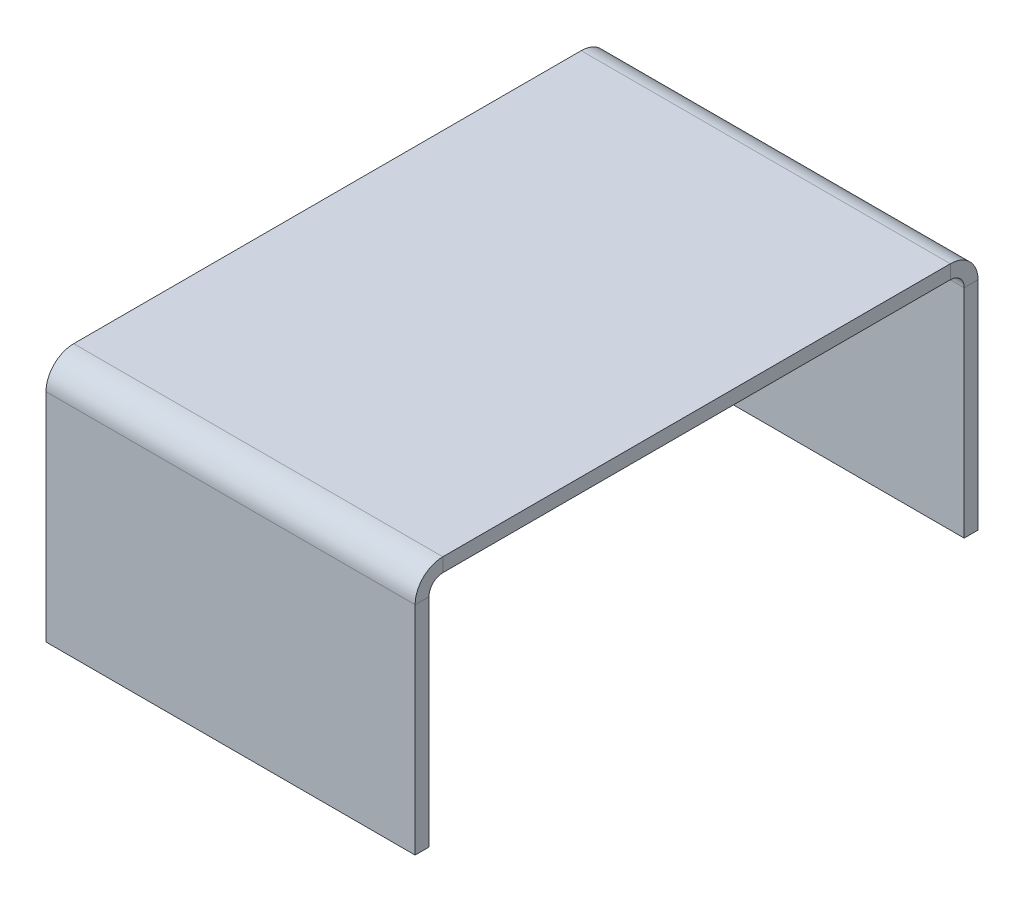
ISO-10303-21;
HEADER;
FILE_DESCRIPTION(('STEP AP214'),'2;1');
FILE_NAME('part.step','',(''),(''),'','','');
FILE_SCHEMA(('AUTOMOTIVE_DESIGN { 1 0 10303 214 1 1 1 1 }'));
ENDSEC;
DATA;
#1=APPLICATION_CONTEXT('core data for automotive mechanical design processes');
#2=APPLICATION_PROTOCOL_DEFINITION('international standard','automotive_design',2000,#1);
#3=PRODUCT_CONTEXT('',#1,'mechanical');
#4=PRODUCT('Part','Part','',(#3));
#5=PRODUCT_RELATED_PRODUCT_CATEGORY('part','',(#4));
#6=PRODUCT_DEFINITION_FORMATION('','',#4);
#7=PRODUCT_DEFINITION_CONTEXT('part definition',#1,'design');
#8=PRODUCT_DEFINITION('design','',#6,#7);
#9=PRODUCT_DEFINITION_SHAPE('','',#8);
#10=(LENGTH_UNIT() NAMED_UNIT(*) SI_UNIT(.MILLI.,.METRE.));
#11=(NAMED_UNIT(*) PLANE_ANGLE_UNIT() SI_UNIT($,.RADIAN.));
#12=(NAMED_UNIT(*) SI_UNIT($,.STERADIAN.) SOLID_ANGLE_UNIT());
#13=UNCERTAINTY_MEASURE_WITH_UNIT(LENGTH_MEASURE(1.E-05),#10,'distance_accuracy_value','');
#14=(GEOMETRIC_REPRESENTATION_CONTEXT(3) GLOBAL_UNCERTAINTY_ASSIGNED_CONTEXT((#13)) GLOBAL_UNIT_ASSIGNED_CONTEXT((#10,
#11,#12)) REPRESENTATION_CONTEXT('',''));
#15=CARTESIAN_POINT('',(0.,0.,0.));
#16=DIRECTION('',(0.,0.,1.));
#17=DIRECTION('',(1.,0.,0.));
#18=AXIS2_PLACEMENT_3D('',#15,#16,#17);
#19=CARTESIAN_POINT('',(40.,25.,58.));
#20=DIRECTION('',(1.,0.,0.));
#21=DIRECTION('',(0.,0.,1.));
#22=AXIS2_PLACEMENT_3D('',#19,#20,#21);
#23=PLANE('',#22);
#24=DIRECTION('',(0.,-1.,0.));
#25=VECTOR('',#24,1.);
#26=CARTESIAN_POINT('',(40.,25.,-55.));
#27=LINE('',#26,#25);
#28=CARTESIAN_POINT('',(40.,28.,-55.));
#29=VERTEX_POINT('',#28);
#30=CARTESIAN_POINT('',(40.,25.,-55.));
#31=VERTEX_POINT('',#30);
#32=EDGE_CURVE('E11',#29,#31,#27,.T.);
#33=ORIENTED_EDGE('',*,*,#32,.F.);
#34=DIRECTION('',(0.,0.,-1.));
#35=VECTOR('',#34,1.);
#36=CARTESIAN_POINT('',(40.,28.,58.));
#37=LINE('',#36,#35);
#38=CARTESIAN_POINT('',(40.,28.,55.));
#39=VERTEX_POINT('',#38);
#40=EDGE_CURVE('E151',#29,#39,#37,.F.);
#41=ORIENTED_EDGE('',*,*,#40,.T.);
#42=DIRECTION('',(0.,-1.,0.));
#43=VECTOR('',#42,1.);
#44=CARTESIAN_POINT('',(40.,25.,55.));
#45=LINE('',#44,#43);
#46=CARTESIAN_POINT('',(40.,25.,55.));
#47=VERTEX_POINT('',#46);
#48=EDGE_CURVE('E47',#39,#47,#45,.T.);
#49=ORIENTED_EDGE('',*,*,#48,.T.);
#50=DIRECTION('',(0.,0.,1.));
#51=VECTOR('',#50,1.);
#52=CARTESIAN_POINT('',(40.,25.,58.));
#53=LINE('',#52,#51);
#54=EDGE_CURVE('E192',#31,#47,#53,.T.);
#55=ORIENTED_EDGE('',*,*,#54,.F.);
#56=EDGE_LOOP('',(#33,#41,#49,#55));
#57=FACE_BOUND('',#56,.T.);
#58=ADVANCED_FACE('F37',(#57),#23,.T.);
#59=CARTESIAN_POINT('',(40.,22.,55.));
#60=DIRECTION('',(1.,0.,0.));
#61=DIRECTION('',(0.,0.,-1.));
#62=AXIS2_PLACEMENT_3D('',#59,#60,#61);
#63=PLANE('',#62);
#64=ORIENTED_EDGE('',*,*,#48,.F.);
#65=CARTESIAN_POINT('',(40.,22.,55.));
#66=DIRECTION('',(1.,0.,0.));
#67=DIRECTION('',(0.,0.,-1.));
#68=AXIS2_PLACEMENT_3D('',#65,#66,#67);
#69=CIRCLE('',#68,6.);
#70=CARTESIAN_POINT('',(40.,22.,61.));
#71=VERTEX_POINT('',#70);
#72=EDGE_CURVE('E152',#39,#71,#69,.T.);
#73=ORIENTED_EDGE('',*,*,#72,.T.);
#74=DIRECTION('',(0.,0.,-1.));
#75=VECTOR('',#74,1.);
#76=CARTESIAN_POINT('',(40.,22.,58.));
#77=LINE('',#76,#75);
#78=CARTESIAN_POINT('',(40.,22.,58.));
#79=VERTEX_POINT('',#78);
#80=EDGE_CURVE('E186',#71,#79,#77,.T.);
#81=ORIENTED_EDGE('',*,*,#80,.T.);
#82=CARTESIAN_POINT('',(40.,22.,55.));
#83=DIRECTION('',(-1.,0.,0.));
#84=DIRECTION('',(0.,0.,1.));
#85=AXIS2_PLACEMENT_3D('',#82,#83,#84);
#86=CIRCLE('',#85,3.);
#87=EDGE_CURVE('E210',#47,#79,#86,.F.);
#88=ORIENTED_EDGE('',*,*,#87,.F.);
#89=EDGE_LOOP('',(#64,#73,#81,#88));
#90=FACE_BOUND('',#89,.T.);
#91=ADVANCED_FACE('F211',(#90),#63,.T.);
#92=CARTESIAN_POINT('',(40.,25.,58.));
#93=DIRECTION('',(1.,0.,0.));
#94=DIRECTION('',(0.,-1.,0.));
#95=AXIS2_PLACEMENT_3D('',#92,#93,#94);
#96=PLANE('',#95);
#97=ORIENTED_EDGE('',*,*,#80,.F.);
#98=DIRECTION('',(0.,1.,0.));
#99=VECTOR('',#98,1.);
#100=CARTESIAN_POINT('',(40.,25.,61.));
#101=LINE('',#100,#99);
#102=CARTESIAN_POINT('',(40.,-25.,61.));
#103=VERTEX_POINT('',#102);
#104=EDGE_CURVE('E158',#71,#103,#101,.F.);
#105=ORIENTED_EDGE('',*,*,#104,.T.);
#106=DIRECTION('',(0.,0.,-1.));
#107=VECTOR('',#106,1.);
#108=CARTESIAN_POINT('',(40.,-25.,58.));
#109=LINE('',#108,#107);
#110=CARTESIAN_POINT('',(40.,-25.,58.));
#111=VERTEX_POINT('',#110);
#112=EDGE_CURVE('E183',#103,#111,#109,.T.);
#113=ORIENTED_EDGE('',*,*,#112,.T.);
#114=DIRECTION('',(0.,-1.,0.));
#115=VECTOR('',#114,1.);
#116=CARTESIAN_POINT('',(40.,25.,58.));
#117=LINE('',#116,#115);
#118=EDGE_CURVE('E266',#79,#111,#117,.T.);
#119=ORIENTED_EDGE('',*,*,#118,.F.);
#120=EDGE_LOOP('',(#97,#105,#113,#119));
#121=FACE_BOUND('',#120,.T.);
#122=ADVANCED_FACE('F265',(#121),#96,.T.);
#123=CARTESIAN_POINT('',(40.,-25.,58.));
#124=DIRECTION('',(0.,-1.,0.));
#125=DIRECTION('',(-1.,0.,0.));
#126=AXIS2_PLACEMENT_3D('',#123,#124,#125);
#127=PLANE('',#126);
#128=ORIENTED_EDGE('',*,*,#112,.F.);
#129=DIRECTION('',(-1.,0.,0.));
#130=VECTOR('',#129,1.);
#131=CARTESIAN_POINT('',(40.,-25.,61.));
#132=LINE('',#131,#130);
#133=CARTESIAN_POINT('',(-40.,-25.,61.));
#134=VERTEX_POINT('',#133);
#135=EDGE_CURVE('E146',#103,#134,#132,.T.);
#136=ORIENTED_EDGE('',*,*,#135,.T.);
#137=DIRECTION('',(0.,0.,-1.));
#138=VECTOR('',#137,1.);
#139=CARTESIAN_POINT('',(-40.,-25.,58.));
#140=LINE('',#139,#138);
#141=CARTESIAN_POINT('',(-40.,-25.,58.));
#142=VERTEX_POINT('',#141);
#143=EDGE_CURVE('E180',#134,#142,#140,.T.);
#144=ORIENTED_EDGE('',*,*,#143,.T.);
#145=DIRECTION('',(-1.,0.,0.));
#146=VECTOR('',#145,1.);
#147=CARTESIAN_POINT('',(40.,-25.,58.));
#148=LINE('',#147,#146);
#149=EDGE_CURVE('E275',#111,#142,#148,.T.);
#150=ORIENTED_EDGE('',*,*,#149,.F.);
#151=EDGE_LOOP('',(#128,#136,#144,#150));
#152=FACE_BOUND('',#151,.T.);
#153=ADVANCED_FACE('F278',(#152),#127,.T.);
#154=CARTESIAN_POINT('',(-40.,25.,58.));
#155=DIRECTION('',(1.,0.,0.));
#156=DIRECTION('',(0.,-1.,0.));
#157=AXIS2_PLACEMENT_3D('',#154,#155,#156);
#158=PLANE('',#157);
#159=ORIENTED_EDGE('',*,*,#143,.F.);
#160=DIRECTION('',(0.,1.,0.));
#161=VECTOR('',#160,1.);
#162=CARTESIAN_POINT('',(-40.,25.,61.));
#163=LINE('',#162,#161);
#164=CARTESIAN_POINT('',(-40.,22.,61.));
#165=VERTEX_POINT('',#164);
#166=EDGE_CURVE('E155',#165,#134,#163,.F.);
#167=ORIENTED_EDGE('',*,*,#166,.F.);
#168=DIRECTION('',(0.,0.,-1.));
#169=VECTOR('',#168,1.);
#170=CARTESIAN_POINT('',(-40.,22.,58.));
#171=LINE('',#170,#169);
#172=CARTESIAN_POINT('',(-40.,22.,58.));
#173=VERTEX_POINT('',#172);
#174=EDGE_CURVE('E177',#165,#173,#171,.T.);
#175=ORIENTED_EDGE('',*,*,#174,.T.);
#176=DIRECTION('',(0.,-1.,0.));
#177=VECTOR('',#176,1.);
#178=CARTESIAN_POINT('',(-40.,25.,58.));
#179=LINE('',#178,#177);
#180=EDGE_CURVE('E206',#173,#142,#179,.T.);
#181=ORIENTED_EDGE('',*,*,#180,.T.);
#182=EDGE_LOOP('',(#159,#167,#175,#181));
#183=FACE_BOUND('',#182,.T.);
#184=ADVANCED_FACE('F306',(#183),#158,.F.);
#185=CARTESIAN_POINT('',(-40.,22.,55.));
#186=DIRECTION('',(-1.,0.,0.));
#187=DIRECTION('',(0.,0.,1.));
#188=AXIS2_PLACEMENT_3D('',#185,#186,#187);
#189=PLANE('',#188);
#190=ORIENTED_EDGE('',*,*,#174,.F.);
#191=CARTESIAN_POINT('',(-40.,22.,55.));
#192=DIRECTION('',(1.,0.,0.));
#193=DIRECTION('',(0.,0.,-1.));
#194=AXIS2_PLACEMENT_3D('',#191,#192,#193);
#195=CIRCLE('',#194,6.);
#196=CARTESIAN_POINT('',(-40.,28.,55.));
#197=VERTEX_POINT('',#196);
#198=EDGE_CURVE('E131',#165,#197,#195,.F.);
#199=ORIENTED_EDGE('',*,*,#198,.T.);
#200=DIRECTION('',(0.,-1.,0.));
#201=VECTOR('',#200,1.);
#202=CARTESIAN_POINT('',(-40.,25.,55.));
#203=LINE('',#202,#201);
#204=CARTESIAN_POINT('',(-40.,25.,55.));
#205=VERTEX_POINT('',#204);
#206=EDGE_CURVE('E174',#197,#205,#203,.T.);
#207=ORIENTED_EDGE('',*,*,#206,.T.);
#208=CARTESIAN_POINT('',(-40.,22.,55.));
#209=DIRECTION('',(1.,0.,0.));
#210=DIRECTION('',(0.,0.,-1.));
#211=AXIS2_PLACEMENT_3D('',#208,#209,#210);
#212=CIRCLE('',#211,3.);
#213=EDGE_CURVE('E216',#173,#205,#212,.F.);
#214=ORIENTED_EDGE('',*,*,#213,.F.);
#215=EDGE_LOOP('',(#190,#199,#207,#214));
#216=FACE_BOUND('',#215,.T.);
#217=ADVANCED_FACE('F309',(#216),#189,.T.);
#218=CARTESIAN_POINT('',(-40.,25.,58.));
#219=DIRECTION('',(1.,0.,0.));
#220=DIRECTION('',(0.,0.,1.));
#221=AXIS2_PLACEMENT_3D('',#218,#219,#220);
#222=PLANE('',#221);
#223=ORIENTED_EDGE('',*,*,#206,.F.);
#224=DIRECTION('',(0.,0.,-1.));
#225=VECTOR('',#224,1.);
#226=CARTESIAN_POINT('',(-40.,28.,58.));
#227=LINE('',#226,#225);
#228=CARTESIAN_POINT('',(-40.,28.,-55.));
#229=VERTEX_POINT('',#228);
#230=EDGE_CURVE('E148',#229,#197,#227,.F.);
#231=ORIENTED_EDGE('',*,*,#230,.F.);
#232=DIRECTION('',(0.,-1.,0.));
#233=VECTOR('',#232,1.);
#234=CARTESIAN_POINT('',(-40.,25.,-55.));
#235=LINE('',#234,#233);
#236=CARTESIAN_POINT('',(-40.,25.,-55.));
#237=VERTEX_POINT('',#236);
#238=EDGE_CURVE('E55',#229,#237,#235,.T.);
#239=ORIENTED_EDGE('',*,*,#238,.T.);
#240=DIRECTION('',(0.,0.,1.));
#241=VECTOR('',#240,1.);
#242=CARTESIAN_POINT('',(-40.,25.,58.));
#243=LINE('',#242,#241);
#244=EDGE_CURVE('E207',#237,#205,#243,.T.);
#245=ORIENTED_EDGE('',*,*,#244,.T.);
#246=EDGE_LOOP('',(#223,#231,#239,#245));
#247=FACE_BOUND('',#246,.T.);
#248=ADVANCED_FACE('F294',(#247),#222,.F.);
#249=CARTESIAN_POINT('',(-40.,22.,-55.));
#250=DIRECTION('',(-1.,0.,0.));
#251=DIRECTION('',(0.,0.,1.));
#252=AXIS2_PLACEMENT_3D('',#249,#250,#251);
#253=PLANE('',#252);
#254=ORIENTED_EDGE('',*,*,#238,.F.);
#255=CARTESIAN_POINT('',(-40.,22.,-55.));
#256=DIRECTION('',(1.,0.,0.));
#257=DIRECTION('',(0.,0.,-1.));
#258=AXIS2_PLACEMENT_3D('',#255,#256,#257);
#259=CIRCLE('',#258,6.);
#260=CARTESIAN_POINT('',(-40.,22.,-61.));
#261=VERTEX_POINT('',#260);
#262=EDGE_CURVE('E132',#229,#261,#259,.F.);
#263=ORIENTED_EDGE('',*,*,#262,.T.);
#264=DIRECTION('',(0.,0.,1.));
#265=VECTOR('',#264,1.);
#266=CARTESIAN_POINT('',(-40.,22.,-58.));
#267=LINE('',#266,#265);
#268=CARTESIAN_POINT('',(-40.,22.,-58.));
#269=VERTEX_POINT('',#268);
#270=EDGE_CURVE('E170',#261,#269,#267,.T.);
#271=ORIENTED_EDGE('',*,*,#270,.T.);
#272=CARTESIAN_POINT('',(-40.,22.,-55.));
#273=DIRECTION('',(1.,0.,0.));
#274=DIRECTION('',(0.,0.,-1.));
#275=AXIS2_PLACEMENT_3D('',#272,#273,#274);
#276=CIRCLE('',#275,3.);
#277=EDGE_CURVE('E235',#237,#269,#276,.F.);
#278=ORIENTED_EDGE('',*,*,#277,.F.);
#279=EDGE_LOOP('',(#254,#263,#271,#278));
#280=FACE_BOUND('',#279,.T.);
#281=ADVANCED_FACE('F287',(#280),#253,.T.);
#282=CARTESIAN_POINT('',(-40.,25.,-58.));
#283=DIRECTION('',(1.,0.,0.));
#284=DIRECTION('',(0.,1.,0.));
#285=AXIS2_PLACEMENT_3D('',#282,#283,#284);
#286=PLANE('',#285);
#287=ORIENTED_EDGE('',*,*,#270,.F.);
#288=DIRECTION('',(0.,1.,0.));
#289=VECTOR('',#288,1.);
#290=CARTESIAN_POINT('',(-40.,25.,-61.));
#291=LINE('',#290,#289);
#292=CARTESIAN_POINT('',(-40.,-25.,-61.));
#293=VERTEX_POINT('',#292);
#294=EDGE_CURVE('E121',#293,#261,#291,.T.);
#295=ORIENTED_EDGE('',*,*,#294,.F.);
#296=DIRECTION('',(0.,0.,1.));
#297=VECTOR('',#296,1.);
#298=CARTESIAN_POINT('',(-40.,-25.,-58.));
#299=LINE('',#298,#297);
#300=CARTESIAN_POINT('',(-40.,-25.,-58.));
#301=VERTEX_POINT('',#300);
#302=EDGE_CURVE('E167',#293,#301,#299,.T.);
#303=ORIENTED_EDGE('',*,*,#302,.T.);
#304=DIRECTION('',(0.,1.,0.));
#305=VECTOR('',#304,1.);
#306=CARTESIAN_POINT('',(-40.,25.,-58.));
#307=LINE('',#306,#305);
#308=EDGE_CURVE('E250',#301,#269,#307,.T.);
#309=ORIENTED_EDGE('',*,*,#308,.T.);
#310=EDGE_LOOP('',(#287,#295,#303,#309));
#311=FACE_BOUND('',#310,.T.);
#312=ADVANCED_FACE('F285',(#311),#286,.F.);
#313=CARTESIAN_POINT('',(40.,-25.,-58.));
#314=DIRECTION('',(0.,1.,0.));
#315=DIRECTION('',(-1.,0.,0.));
#316=AXIS2_PLACEMENT_3D('',#313,#314,#315);
#317=PLANE('',#316);
#318=ORIENTED_EDGE('',*,*,#302,.F.);
#319=DIRECTION('',(1.,0.,0.));
#320=VECTOR('',#319,1.);
#321=CARTESIAN_POINT('',(40.,-25.,-61.));
#322=LINE('',#321,#320);
#323=CARTESIAN_POINT('',(40.,-25.,-61.));
#324=VERTEX_POINT('',#323);
#325=EDGE_CURVE('E138',#324,#293,#322,.F.);
#326=ORIENTED_EDGE('',*,*,#325,.F.);
#327=DIRECTION('',(0.,0.,1.));
#328=VECTOR('',#327,1.);
#329=CARTESIAN_POINT('',(40.,-25.,-58.));
#330=LINE('',#329,#328);
#331=CARTESIAN_POINT('',(40.,-25.,-58.));
#332=VERTEX_POINT('',#331);
#333=EDGE_CURVE('E110',#324,#332,#330,.T.);
#334=ORIENTED_EDGE('',*,*,#333,.T.);
#335=DIRECTION('',(-1.,0.,0.));
#336=VECTOR('',#335,1.);
#337=CARTESIAN_POINT('',(40.,-25.,-58.));
#338=LINE('',#337,#336);
#339=EDGE_CURVE('E227',#332,#301,#338,.T.);
#340=ORIENTED_EDGE('',*,*,#339,.T.);
#341=EDGE_LOOP('',(#318,#326,#334,#340));
#342=FACE_BOUND('',#341,.T.);
#343=ADVANCED_FACE('F283',(#342),#317,.F.);
#344=CARTESIAN_POINT('',(40.,25.,-58.));
#345=DIRECTION('',(1.,0.,0.));
#346=DIRECTION('',(0.,1.,0.));
#347=AXIS2_PLACEMENT_3D('',#344,#345,#346);
#348=PLANE('',#347);
#349=ORIENTED_EDGE('',*,*,#333,.F.);
#350=DIRECTION('',(0.,1.,0.));
#351=VECTOR('',#350,1.);
#352=CARTESIAN_POINT('',(40.,25.,-61.));
#353=LINE('',#352,#351);
#354=CARTESIAN_POINT('',(40.,22.,-61.));
#355=VERTEX_POINT('',#354);
#356=EDGE_CURVE('E119',#324,#355,#353,.T.);
#357=ORIENTED_EDGE('',*,*,#356,.T.);
#358=DIRECTION('',(0.,0.,1.));
#359=VECTOR('',#358,1.);
#360=CARTESIAN_POINT('',(40.,22.,-58.));
#361=LINE('',#360,#359);
#362=CARTESIAN_POINT('',(40.,22.,-58.));
#363=VERTEX_POINT('',#362);
#364=EDGE_CURVE('E41',#355,#363,#361,.T.);
#365=ORIENTED_EDGE('',*,*,#364,.T.);
#366=DIRECTION('',(0.,1.,0.));
#367=VECTOR('',#366,1.);
#368=CARTESIAN_POINT('',(40.,25.,-58.));
#369=LINE('',#368,#367);
#370=EDGE_CURVE('E222',#332,#363,#369,.T.);
#371=ORIENTED_EDGE('',*,*,#370,.F.);
#372=EDGE_LOOP('',(#349,#357,#365,#371));
#373=FACE_BOUND('',#372,.T.);
#374=ADVANCED_FACE('F134',(#373),#348,.T.);
#375=CARTESIAN_POINT('',(40.,22.,-55.));
#376=DIRECTION('',(1.,0.,0.));
#377=DIRECTION('',(0.,0.,-1.));
#378=AXIS2_PLACEMENT_3D('',#375,#376,#377);
#379=PLANE('',#378);
#380=CARTESIAN_POINT('',(40.,22.,-55.));
#381=DIRECTION('',(1.,0.,0.));
#382=DIRECTION('',(0.,0.,-1.));
#383=AXIS2_PLACEMENT_3D('',#380,#381,#382);
#384=CIRCLE('',#383,6.);
#385=EDGE_CURVE('E103',#355,#29,#384,.T.);
#386=ORIENTED_EDGE('',*,*,#385,.T.);
#387=ORIENTED_EDGE('',*,*,#32,.T.);
#388=CARTESIAN_POINT('',(40.,22.,-55.));
#389=DIRECTION('',(-1.,0.,0.));
#390=DIRECTION('',(0.,0.,1.));
#391=AXIS2_PLACEMENT_3D('',#388,#389,#390);
#392=CIRCLE('',#391,3.);
#393=EDGE_CURVE('E105',#363,#31,#392,.F.);
#394=ORIENTED_EDGE('',*,*,#393,.F.);
#395=ORIENTED_EDGE('',*,*,#364,.F.);
#396=EDGE_LOOP('',(#386,#387,#394,#395));
#397=FACE_BOUND('',#396,.T.);
#398=ADVANCED_FACE('F39',(#397),#379,.T.);
#399=CARTESIAN_POINT('',(40.,25.,-58.));
#400=DIRECTION('',(0.,0.,1.));
#401=DIRECTION('',(1.,0.,0.));
#402=AXIS2_PLACEMENT_3D('',#399,#400,#401);
#403=PLANE('',#402);
#404=ORIENTED_EDGE('',*,*,#370,.T.);
#405=DIRECTION('',(-1.,0.,0.));
#406=VECTOR('',#405,1.);
#407=CARTESIAN_POINT('',(-40.,22.,-58.));
#408=LINE('',#407,#406);
#409=EDGE_CURVE('E225',#363,#269,#408,.T.);
#410=ORIENTED_EDGE('',*,*,#409,.T.);
#411=ORIENTED_EDGE('',*,*,#308,.F.);
#412=ORIENTED_EDGE('',*,*,#339,.F.);
#413=EDGE_LOOP('',(#404,#410,#411,#412));
#414=FACE_BOUND('',#413,.T.);
#415=ADVANCED_FACE('F247',(#414),#403,.T.);
#416=CARTESIAN_POINT('',(40.,25.,58.));
#417=DIRECTION('',(0.,0.,-1.));
#418=DIRECTION('',(-1.,0.,0.));
#419=AXIS2_PLACEMENT_3D('',#416,#417,#418);
#420=PLANE('',#419);
#421=ORIENTED_EDGE('',*,*,#180,.F.);
#422=DIRECTION('',(-1.,0.,0.));
#423=VECTOR('',#422,1.);
#424=CARTESIAN_POINT('',(40.,22.,58.));
#425=LINE('',#424,#423);
#426=EDGE_CURVE('E221',#173,#79,#425,.F.);
#427=ORIENTED_EDGE('',*,*,#426,.T.);
#428=ORIENTED_EDGE('',*,*,#118,.T.);
#429=ORIENTED_EDGE('',*,*,#149,.T.);
#430=EDGE_LOOP('',(#421,#427,#428,#429));
#431=FACE_BOUND('',#430,.T.);
#432=ADVANCED_FACE('F274',(#431),#420,.T.);
#433=CARTESIAN_POINT('',(40.,25.,58.));
#434=DIRECTION('',(0.,-1.,0.));
#435=DIRECTION('',(0.,0.,-1.));
#436=AXIS2_PLACEMENT_3D('',#433,#434,#435);
#437=PLANE('',#436);
#438=ORIENTED_EDGE('',*,*,#244,.F.);
#439=DIRECTION('',(-1.,0.,0.));
#440=VECTOR('',#439,1.);
#441=CARTESIAN_POINT('',(40.,25.,-55.));
#442=LINE('',#441,#440);
#443=EDGE_CURVE('E111',#237,#31,#442,.F.);
#444=ORIENTED_EDGE('',*,*,#443,.T.);
#445=ORIENTED_EDGE('',*,*,#54,.T.);
#446=DIRECTION('',(-1.,0.,0.));
#447=VECTOR('',#446,1.);
#448=CARTESIAN_POINT('',(-40.,25.,55.));
#449=LINE('',#448,#447);
#450=EDGE_CURVE('E204',#47,#205,#449,.T.);
#451=ORIENTED_EDGE('',*,*,#450,.T.);
#452=EDGE_LOOP('',(#438,#444,#445,#451));
#453=FACE_BOUND('',#452,.T.);
#454=ADVANCED_FACE('F202',(#453),#437,.T.);
#455=CARTESIAN_POINT('',(40.,22.,55.));
#456=DIRECTION('',(1.,0.,0.));
#457=DIRECTION('',(0.,0.,-1.));
#458=AXIS2_PLACEMENT_3D('',#455,#456,#457);
#459=CYLINDRICAL_SURFACE('',#458,3.);
#460=ORIENTED_EDGE('',*,*,#87,.T.);
#461=ORIENTED_EDGE('',*,*,#426,.F.);
#462=ORIENTED_EDGE('',*,*,#213,.T.);
#463=ORIENTED_EDGE('',*,*,#450,.F.);
#464=EDGE_LOOP('',(#460,#461,#462,#463));
#465=FACE_BOUND('',#464,.T.);
#466=ADVANCED_FACE('F219',(#465),#459,.F.);
#467=CARTESIAN_POINT('',(40.,22.,-55.));
#468=DIRECTION('',(1.,0.,0.));
#469=DIRECTION('',(0.,0.,-1.));
#470=AXIS2_PLACEMENT_3D('',#467,#468,#469);
#471=CYLINDRICAL_SURFACE('',#470,3.);
#472=ORIENTED_EDGE('',*,*,#393,.T.);
#473=ORIENTED_EDGE('',*,*,#443,.F.);
#474=ORIENTED_EDGE('',*,*,#277,.T.);
#475=ORIENTED_EDGE('',*,*,#409,.F.);
#476=EDGE_LOOP('',(#472,#473,#474,#475));
#477=FACE_BOUND('',#476,.T.);
#478=ADVANCED_FACE('F241',(#477),#471,.F.);
#479=CARTESIAN_POINT('',(40.,25.,-61.));
#480=DIRECTION('',(0.,0.,1.));
#481=DIRECTION('',(1.,0.,0.));
#482=AXIS2_PLACEMENT_3D('',#479,#480,#481);
#483=PLANE('',#482);
#484=ORIENTED_EDGE('',*,*,#356,.F.);
#485=ORIENTED_EDGE('',*,*,#325,.T.);
#486=ORIENTED_EDGE('',*,*,#294,.T.);
#487=DIRECTION('',(1.,0.,0.));
#488=VECTOR('',#487,1.);
#489=CARTESIAN_POINT('',(40.,22.,-61.));
#490=LINE('',#489,#488);
#491=EDGE_CURVE('E116',#355,#261,#490,.F.);
#492=ORIENTED_EDGE('',*,*,#491,.F.);
#493=EDGE_LOOP('',(#484,#485,#486,#492));
#494=FACE_BOUND('',#493,.T.);
#495=ADVANCED_FACE('F117',(#494),#483,.F.);
#496=CARTESIAN_POINT('',(40.,25.,61.));
#497=DIRECTION('',(0.,0.,-1.));
#498=DIRECTION('',(-1.,0.,0.));
#499=AXIS2_PLACEMENT_3D('',#496,#497,#498);
#500=PLANE('',#499);
#501=ORIENTED_EDGE('',*,*,#166,.T.);
#502=ORIENTED_EDGE('',*,*,#135,.F.);
#503=ORIENTED_EDGE('',*,*,#104,.F.);
#504=DIRECTION('',(-1.,0.,0.));
#505=VECTOR('',#504,1.);
#506=CARTESIAN_POINT('',(40.,22.,61.));
#507=LINE('',#506,#505);
#508=EDGE_CURVE('E126',#165,#71,#507,.F.);
#509=ORIENTED_EDGE('',*,*,#508,.F.);
#510=EDGE_LOOP('',(#501,#502,#503,#509));
#511=FACE_BOUND('',#510,.T.);
#512=ADVANCED_FACE('F327',(#511),#500,.F.);
#513=CARTESIAN_POINT('',(40.,28.,58.));
#514=DIRECTION('',(0.,-1.,0.));
#515=DIRECTION('',(0.,0.,-1.));
#516=AXIS2_PLACEMENT_3D('',#513,#514,#515);
#517=PLANE('',#516);
#518=ORIENTED_EDGE('',*,*,#230,.T.);
#519=DIRECTION('',(1.,0.,0.));
#520=VECTOR('',#519,1.);
#521=CARTESIAN_POINT('',(40.,28.,55.));
#522=LINE('',#521,#520);
#523=EDGE_CURVE('E137',#39,#197,#522,.F.);
#524=ORIENTED_EDGE('',*,*,#523,.F.);
#525=ORIENTED_EDGE('',*,*,#40,.F.);
#526=DIRECTION('',(1.,0.,0.));
#527=VECTOR('',#526,1.);
#528=CARTESIAN_POINT('',(40.,28.,-55.));
#529=LINE('',#528,#527);
#530=EDGE_CURVE('E125',#229,#29,#529,.T.);
#531=ORIENTED_EDGE('',*,*,#530,.F.);
#532=EDGE_LOOP('',(#518,#524,#525,#531));
#533=FACE_BOUND('',#532,.T.);
#534=ADVANCED_FACE('F324',(#533),#517,.F.);
#535=CARTESIAN_POINT('',(40.,22.,55.));
#536=DIRECTION('',(1.,0.,0.));
#537=DIRECTION('',(0.,0.,-1.));
#538=AXIS2_PLACEMENT_3D('',#535,#536,#537);
#539=CYLINDRICAL_SURFACE('',#538,6.);
#540=ORIENTED_EDGE('',*,*,#72,.F.);
#541=ORIENTED_EDGE('',*,*,#523,.T.);
#542=ORIENTED_EDGE('',*,*,#198,.F.);
#543=ORIENTED_EDGE('',*,*,#508,.T.);
#544=EDGE_LOOP('',(#540,#541,#542,#543));
#545=FACE_BOUND('',#544,.T.);
#546=ADVANCED_FACE('F320',(#545),#539,.T.);
#547=CARTESIAN_POINT('',(40.,22.,-55.));
#548=DIRECTION('',(1.,0.,0.));
#549=DIRECTION('',(0.,0.,-1.));
#550=AXIS2_PLACEMENT_3D('',#547,#548,#549);
#551=CYLINDRICAL_SURFACE('',#550,6.);
#552=ORIENTED_EDGE('',*,*,#385,.F.);
#553=ORIENTED_EDGE('',*,*,#491,.T.);
#554=ORIENTED_EDGE('',*,*,#262,.F.);
#555=ORIENTED_EDGE('',*,*,#530,.T.);
#556=EDGE_LOOP('',(#552,#553,#554,#555));
#557=FACE_BOUND('',#556,.T.);
#558=ADVANCED_FACE('F128',(#557),#551,.T.);
#559=CLOSED_SHELL('',(#58,#91,#122,#153,#184,#217,#248,#281,#312,#343,#374,#398,#415,#432,#454,
#466,#478,#495,#512,#534,#546,#558));
#560=MANIFOLD_SOLID_BREP('B2',#559);
#561=ADVANCED_BREP_SHAPE_REPRESENTATION('',(#18,#560),#14);
#562=SHAPE_DEFINITION_REPRESENTATION(#9,#561);
ENDSEC;
END-ISO-10303-21;
